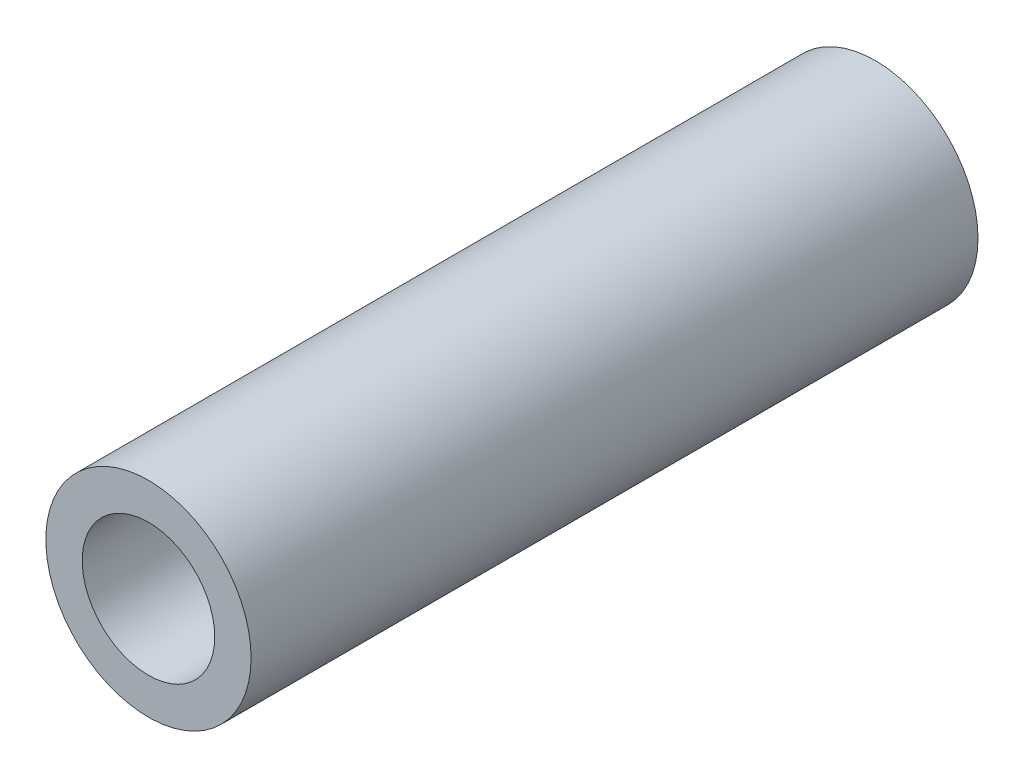
ISO-10303-21;
HEADER;
FILE_DESCRIPTION(('STEP AP214'),'2;1');
FILE_NAME('part.step','',(''),(''),'','','');
FILE_SCHEMA(('AUTOMOTIVE_DESIGN { 1 0 10303 214 1 1 1 1 }'));
ENDSEC;
DATA;
#1=APPLICATION_CONTEXT('core data for automotive mechanical design processes');
#2=APPLICATION_PROTOCOL_DEFINITION('international standard','automotive_design',2000,#1);
#3=PRODUCT_CONTEXT('',#1,'mechanical');
#4=PRODUCT('Part','Part','',(#3));
#5=PRODUCT_RELATED_PRODUCT_CATEGORY('part','',(#4));
#6=PRODUCT_DEFINITION_FORMATION('','',#4);
#7=PRODUCT_DEFINITION_CONTEXT('part definition',#1,'design');
#8=PRODUCT_DEFINITION('design','',#6,#7);
#9=PRODUCT_DEFINITION_SHAPE('','',#8);
#10=(LENGTH_UNIT() NAMED_UNIT(*) SI_UNIT(.MILLI.,.METRE.));
#11=(NAMED_UNIT(*) PLANE_ANGLE_UNIT() SI_UNIT($,.RADIAN.));
#12=(NAMED_UNIT(*) SI_UNIT($,.STERADIAN.) SOLID_ANGLE_UNIT());
#13=UNCERTAINTY_MEASURE_WITH_UNIT(LENGTH_MEASURE(1.E-05),#10,'distance_accuracy_value','');
#14=(GEOMETRIC_REPRESENTATION_CONTEXT(3) GLOBAL_UNCERTAINTY_ASSIGNED_CONTEXT((#13)) GLOBAL_UNIT_ASSIGNED_CONTEXT((#10,
#11,#12)) REPRESENTATION_CONTEXT('',''));
#15=CARTESIAN_POINT('',(0.,0.,0.));
#16=DIRECTION('',(0.,0.,1.));
#17=DIRECTION('',(1.,0.,0.));
#18=AXIS2_PLACEMENT_3D('',#15,#16,#17);
#19=CARTESIAN_POINT('',(0.,0.,17.));
#20=DIRECTION('',(0.,0.,1.));
#21=DIRECTION('',(1.,0.,0.));
#22=AXIS2_PLACEMENT_3D('',#19,#20,#21);
#23=PLANE('',#22);
#24=CARTESIAN_POINT('',(0.,0.,17.));
#25=DIRECTION('',(0.,0.,1.));
#26=DIRECTION('',(1.,0.,0.));
#27=AXIS2_PLACEMENT_3D('',#24,#25,#26);
#28=CIRCLE('',#27,2.4);
#29=CARTESIAN_POINT('',(2.4,0.,17.));
#30=VERTEX_POINT('',#29);
#31=EDGE_CURVE('E10',#30,#30,#28,.T.);
#32=ORIENTED_EDGE('',*,*,#31,.T.);
#33=EDGE_LOOP('',(#32));
#34=FACE_BOUND('',#33,.T.);
#35=CARTESIAN_POINT('',(0.,0.,17.));
#36=DIRECTION('',(0.,0.,1.));
#37=DIRECTION('',(1.,0.,0.));
#38=AXIS2_PLACEMENT_3D('',#35,#36,#37);
#39=CIRCLE('',#38,1.55);
#40=CARTESIAN_POINT('',(1.55,0.,17.));
#41=VERTEX_POINT('',#40);
#42=EDGE_CURVE('E42',#41,#41,#39,.T.);
#43=ORIENTED_EDGE('',*,*,#42,.F.);
#44=EDGE_LOOP('',(#43));
#45=FACE_BOUND('',#44,.T.);
#46=ADVANCED_FACE('F31',(#34,#45),#23,.T.);
#47=CARTESIAN_POINT('',(0.,0.,0.));
#48=DIRECTION('',(0.,0.,1.));
#49=DIRECTION('',(1.,0.,0.));
#50=AXIS2_PLACEMENT_3D('',#47,#48,#49);
#51=PLANE('',#50);
#52=CARTESIAN_POINT('',(0.,0.,0.));
#53=DIRECTION('',(0.,0.,1.));
#54=DIRECTION('',(1.,0.,0.));
#55=AXIS2_PLACEMENT_3D('',#52,#53,#54);
#56=CIRCLE('',#55,2.4);
#57=CARTESIAN_POINT('',(2.4,0.,0.));
#58=VERTEX_POINT('',#57);
#59=EDGE_CURVE('E35',#58,#58,#56,.T.);
#60=ORIENTED_EDGE('',*,*,#59,.F.);
#61=EDGE_LOOP('',(#60));
#62=FACE_BOUND('',#61,.T.);
#63=CARTESIAN_POINT('',(0.,0.,0.));
#64=DIRECTION('',(0.,0.,1.));
#65=DIRECTION('',(1.,0.,0.));
#66=AXIS2_PLACEMENT_3D('',#63,#64,#65);
#67=CIRCLE('',#66,1.55);
#68=CARTESIAN_POINT('',(1.55,0.,0.));
#69=VERTEX_POINT('',#68);
#70=EDGE_CURVE('E44',#69,#69,#67,.T.);
#71=ORIENTED_EDGE('',*,*,#70,.T.);
#72=EDGE_LOOP('',(#71));
#73=FACE_BOUND('',#72,.T.);
#74=ADVANCED_FACE('F54',(#62,#73),#51,.F.);
#75=CARTESIAN_POINT('',(0.,0.,17.));
#76=DIRECTION('',(0.,0.,-1.));
#77=DIRECTION('',(-1.,0.,0.));
#78=AXIS2_PLACEMENT_3D('',#75,#76,#77);
#79=CYLINDRICAL_SURFACE('',#78,2.4);
#80=ORIENTED_EDGE('',*,*,#31,.F.);
#81=EDGE_LOOP('',(#80));
#82=FACE_BOUND('',#81,.T.);
#83=ORIENTED_EDGE('',*,*,#59,.T.);
#84=EDGE_LOOP('',(#83));
#85=FACE_BOUND('',#84,.T.);
#86=ADVANCED_FACE('F33',(#82,#85),#79,.T.);
#87=CARTESIAN_POINT('',(0.,0.,17.));
#88=DIRECTION('',(0.,0.,-1.));
#89=DIRECTION('',(-1.,0.,0.));
#90=AXIS2_PLACEMENT_3D('',#87,#88,#89);
#91=CYLINDRICAL_SURFACE('',#90,1.55);
#92=ORIENTED_EDGE('',*,*,#42,.T.);
#93=EDGE_LOOP('',(#92));
#94=FACE_BOUND('',#93,.T.);
#95=ORIENTED_EDGE('',*,*,#70,.F.);
#96=EDGE_LOOP('',(#95));
#97=FACE_BOUND('',#96,.T.);
#98=ADVANCED_FACE('F50',(#94,#97),#91,.F.);
#99=CLOSED_SHELL('',(#46,#74,#86,#98));
#100=MANIFOLD_SOLID_BREP('B2',#99);
#101=ADVANCED_BREP_SHAPE_REPRESENTATION('',(#18,#100),#14);
#102=SHAPE_DEFINITION_REPRESENTATION(#9,#101);
ENDSEC;
END-ISO-10303-21;
